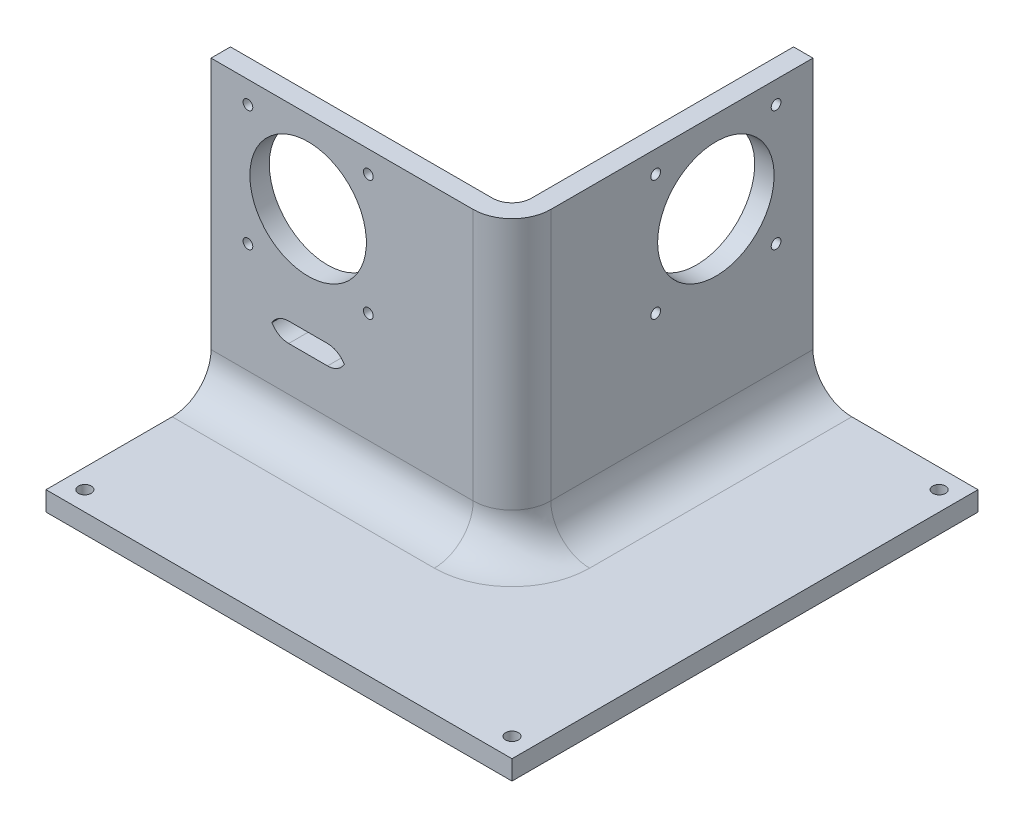
ISO-10303-21;
HEADER;
FILE_DESCRIPTION(('STEP AP214'),'2;1');
FILE_NAME('part.step','',(''),(''),'','','');
FILE_SCHEMA(('AUTOMOTIVE_DESIGN { 1 0 10303 214 1 1 1 1 }'));
ENDSEC;
DATA;
#1=APPLICATION_CONTEXT('core data for automotive mechanical design processes');
#2=APPLICATION_PROTOCOL_DEFINITION('international standard','automotive_design',2000,#1);
#3=PRODUCT_CONTEXT('',#1,'mechanical');
#4=PRODUCT('Part','Part','',(#3));
#5=PRODUCT_RELATED_PRODUCT_CATEGORY('part','',(#4));
#6=PRODUCT_DEFINITION_FORMATION('','',#4);
#7=PRODUCT_DEFINITION_CONTEXT('part definition',#1,'design');
#8=PRODUCT_DEFINITION('design','',#6,#7);
#9=PRODUCT_DEFINITION_SHAPE('','',#8);
#10=(LENGTH_UNIT() NAMED_UNIT(*) SI_UNIT(.MILLI.,.METRE.));
#11=(NAMED_UNIT(*) PLANE_ANGLE_UNIT() SI_UNIT($,.RADIAN.));
#12=(NAMED_UNIT(*) SI_UNIT($,.STERADIAN.) SOLID_ANGLE_UNIT());
#13=UNCERTAINTY_MEASURE_WITH_UNIT(LENGTH_MEASURE(1.E-05),#10,'distance_accuracy_value','');
#14=(GEOMETRIC_REPRESENTATION_CONTEXT(3) GLOBAL_UNCERTAINTY_ASSIGNED_CONTEXT((#13)) GLOBAL_UNIT_ASSIGNED_CONTEXT((#10,
#11,#12)) REPRESENTATION_CONTEXT('',''));
#15=CARTESIAN_POINT('',(0.,0.,0.));
#16=DIRECTION('',(0.,0.,1.));
#17=DIRECTION('',(1.,0.,0.));
#18=AXIS2_PLACEMENT_3D('',#15,#16,#17);
#19=CARTESIAN_POINT('',(0.,20.,-72.5));
#20=DIRECTION('',(0.,0.,-1.));
#21=DIRECTION('',(-1.,0.,0.));
#22=AXIS2_PLACEMENT_3D('',#19,#20,#21);
#23=PLANE('',#22);
#24=DIRECTION('',(0.,-1.,0.));
#25=VECTOR('',#24,1.);
#26=CARTESIAN_POINT('',(5.,80.,-72.5));
#27=LINE('',#26,#25);
#28=CARTESIAN_POINT('',(5.,80.,-72.5));
#29=VERTEX_POINT('',#28);
#30=CARTESIAN_POINT('',(5.,15.,-72.5));
#31=VERTEX_POINT('',#30);
#32=EDGE_CURVE('E294',#29,#31,#27,.T.);
#33=ORIENTED_EDGE('',*,*,#32,.T.);
#34=CARTESIAN_POINT('',(15.,15.,-72.5));
#35=DIRECTION('',(0.,0.,-1.));
#36=DIRECTION('',(-1.,0.,0.));
#37=AXIS2_PLACEMENT_3D('',#34,#35,#36);
#38=CIRCLE('',#37,10.);
#39=CARTESIAN_POINT('',(15.,5.,-72.5));
#40=VERTEX_POINT('',#39);
#41=EDGE_CURVE('E377',#31,#40,#38,.F.);
#42=ORIENTED_EDGE('',*,*,#41,.T.);
#43=DIRECTION('',(-1.,0.,0.));
#44=VECTOR('',#43,1.);
#45=CARTESIAN_POINT('',(47.5,5.,-72.5));
#46=LINE('',#45,#44);
#47=CARTESIAN_POINT('',(47.5,5.,-72.5));
#48=VERTEX_POINT('',#47);
#49=EDGE_CURVE('E215',#48,#40,#46,.T.);
#50=ORIENTED_EDGE('',*,*,#49,.F.);
#51=DIRECTION('',(0.,1.,0.));
#52=VECTOR('',#51,1.);
#53=CARTESIAN_POINT('',(47.5,-80.,-72.5));
#54=LINE('',#53,#52);
#55=CARTESIAN_POINT('',(47.5,0.,-72.5));
#56=VERTEX_POINT('',#55);
#57=EDGE_CURVE('E224',#56,#48,#54,.T.);
#58=ORIENTED_EDGE('',*,*,#57,.F.);
#59=DIRECTION('',(1.,0.,0.));
#60=VECTOR('',#59,1.);
#61=CARTESIAN_POINT('',(0.,0.,-72.5));
#62=LINE('',#61,#60);
#63=CARTESIAN_POINT('',(0.,0.,-72.5));
#64=VERTEX_POINT('',#63);
#65=EDGE_CURVE('E305',#64,#56,#62,.T.);
#66=ORIENTED_EDGE('',*,*,#65,.F.);
#67=DIRECTION('',(0.,-1.,0.));
#68=VECTOR('',#67,1.);
#69=CARTESIAN_POINT('',(0.,20.,-72.5));
#70=LINE('',#69,#68);
#71=CARTESIAN_POINT('',(0.,80.,-72.5));
#72=VERTEX_POINT('',#71);
#73=EDGE_CURVE('E308',#72,#64,#70,.T.);
#74=ORIENTED_EDGE('',*,*,#73,.F.);
#75=DIRECTION('',(-1.,0.,0.));
#76=VECTOR('',#75,1.);
#77=CARTESIAN_POINT('',(0.,80.,-72.5));
#78=LINE('',#77,#76);
#79=EDGE_CURVE('E288',#29,#72,#78,.T.);
#80=ORIENTED_EDGE('',*,*,#79,.F.);
#81=EDGE_LOOP('',(#33,#42,#50,#58,#66,#74,#80));
#82=FACE_BOUND('',#81,.T.);
#83=ADVANCED_FACE('F71',(#82),#23,.T.);
#84=CARTESIAN_POINT('',(0.,0.,0.));
#85=DIRECTION('',(0.,1.,0.));
#86=DIRECTION('',(0.,0.,1.));
#87=AXIS2_PLACEMENT_3D('',#84,#85,#86);
#88=PLANE('',#87);
#89=CARTESIAN_POINT('',(42.5,0.,-67.5));
#90=DIRECTION('',(0.,1.,0.));
#91=DIRECTION('',(0.,0.,1.));
#92=AXIS2_PLACEMENT_3D('',#89,#90,#91);
#93=CIRCLE('',#92,1.65);
#94=CARTESIAN_POINT('',(42.5,0.,-65.85));
#95=VERTEX_POINT('',#94);
#96=EDGE_CURVE('E231',#95,#95,#93,.T.);
#97=ORIENTED_EDGE('',*,*,#96,.T.);
#98=EDGE_LOOP('',(#97));
#99=FACE_BOUND('',#98,.T.);
#100=CARTESIAN_POINT('',(42.5,0.,42.5));
#101=DIRECTION('',(0.,1.,0.));
#102=DIRECTION('',(0.,0.,1.));
#103=AXIS2_PLACEMENT_3D('',#100,#101,#102);
#104=CIRCLE('',#103,1.65);
#105=CARTESIAN_POINT('',(42.5,0.,44.15));
#106=VERTEX_POINT('',#105);
#107=EDGE_CURVE('E235',#106,#106,#104,.T.);
#108=ORIENTED_EDGE('',*,*,#107,.T.);
#109=EDGE_LOOP('',(#108));
#110=FACE_BOUND('',#109,.T.);
#111=CARTESIAN_POINT('',(-67.5,0.,42.5));
#112=DIRECTION('',(0.,1.,0.));
#113=DIRECTION('',(0.,0.,1.));
#114=AXIS2_PLACEMENT_3D('',#111,#112,#113);
#115=CIRCLE('',#114,1.65);
#116=CARTESIAN_POINT('',(-67.5,0.,44.15));
#117=VERTEX_POINT('',#116);
#118=EDGE_CURVE('E350',#117,#117,#115,.T.);
#119=ORIENTED_EDGE('',*,*,#118,.T.);
#120=EDGE_LOOP('',(#119));
#121=FACE_BOUND('',#120,.T.);
#122=DIRECTION('',(0.,0.,-1.));
#123=VECTOR('',#122,1.);
#124=CARTESIAN_POINT('',(47.5,0.,0.));
#125=LINE('',#124,#123);
#126=CARTESIAN_POINT('',(47.5,0.,47.5));
#127=VERTEX_POINT('',#126);
#128=EDGE_CURVE('E347',#127,#56,#125,.T.);
#129=ORIENTED_EDGE('',*,*,#128,.F.);
#130=DIRECTION('',(-1.,0.,0.));
#131=VECTOR('',#130,1.);
#132=CARTESIAN_POINT('',(0.,0.,47.5));
#133=LINE('',#132,#131);
#134=CARTESIAN_POINT('',(-72.5,0.,47.5));
#135=VERTEX_POINT('',#134);
#136=EDGE_CURVE('E229',#127,#135,#133,.T.);
#137=ORIENTED_EDGE('',*,*,#136,.T.);
#138=DIRECTION('',(0.,0.,-1.));
#139=VECTOR('',#138,1.);
#140=CARTESIAN_POINT('',(-72.5,0.,0.));
#141=LINE('',#140,#139);
#142=CARTESIAN_POINT('',(-72.5,0.,0.));
#143=VERTEX_POINT('',#142);
#144=EDGE_CURVE('E303',#135,#143,#141,.T.);
#145=ORIENTED_EDGE('',*,*,#144,.T.);
#146=DIRECTION('',(-1.,0.,0.));
#147=VECTOR('',#146,1.);
#148=CARTESIAN_POINT('',(0.,0.,0.));
#149=LINE('',#148,#147);
#150=CARTESIAN_POINT('',(-5.,0.,0.));
#151=VERTEX_POINT('',#150);
#152=EDGE_CURVE('E300',#151,#143,#149,.T.);
#153=ORIENTED_EDGE('',*,*,#152,.F.);
#154=CARTESIAN_POINT('',(-5.,0.,-5.));
#155=DIRECTION('',(0.,1.,0.));
#156=DIRECTION('',(0.,0.,1.));
#157=AXIS2_PLACEMENT_3D('',#154,#155,#156);
#158=CIRCLE('',#157,5.);
#159=CARTESIAN_POINT('',(0.,0.,-5.));
#160=VERTEX_POINT('',#159);
#161=EDGE_CURVE('E342',#151,#160,#158,.T.);
#162=ORIENTED_EDGE('',*,*,#161,.T.);
#163=DIRECTION('',(0.,0.,1.));
#164=VECTOR('',#163,1.);
#165=CARTESIAN_POINT('',(0.,0.,0.));
#166=LINE('',#165,#164);
#167=EDGE_CURVE('E297',#64,#160,#166,.T.);
#168=ORIENTED_EDGE('',*,*,#167,.F.);
#169=ORIENTED_EDGE('',*,*,#65,.T.);
#170=EDGE_LOOP('',(#129,#137,#145,#153,#162,#168,#169));
#171=FACE_BOUND('',#170,.T.);
#172=ADVANCED_FACE('F468',(#99,#110,#121,#171),#88,.F.);
#173=CARTESIAN_POINT('',(0.,20.,0.));
#174=DIRECTION('',(1.,0.,0.));
#175=DIRECTION('',(0.,0.,-1.));
#176=AXIS2_PLACEMENT_3D('',#173,#174,#175);
#177=PLANE('',#176);
#178=CARTESIAN_POINT('',(0.,43.35,-32.));
#179=DIRECTION('',(-1.,0.,0.));
#180=DIRECTION('',(0.,0.,1.));
#181=AXIS2_PLACEMENT_3D('',#178,#179,#180);
#182=CIRCLE('',#181,1.25);
#183=CARTESIAN_POINT('',(0.,43.35,-30.75));
#184=VERTEX_POINT('',#183);
#185=EDGE_CURVE('E268',#184,#184,#182,.T.);
#186=ORIENTED_EDGE('',*,*,#185,.F.);
#187=EDGE_LOOP('',(#186));
#188=FACE_BOUND('',#187,.T.);
#189=CARTESIAN_POINT('',(0.,43.35,-63.));
#190=DIRECTION('',(-1.,0.,0.));
#191=DIRECTION('',(0.,0.,1.));
#192=AXIS2_PLACEMENT_3D('',#189,#190,#191);
#193=CIRCLE('',#192,1.25);
#194=CARTESIAN_POINT('',(0.,43.35,-61.75));
#195=VERTEX_POINT('',#194);
#196=EDGE_CURVE('E273',#195,#195,#193,.T.);
#197=ORIENTED_EDGE('',*,*,#196,.F.);
#198=EDGE_LOOP('',(#197));
#199=FACE_BOUND('',#198,.T.);
#200=CARTESIAN_POINT('',(0.,74.35,-63.));
#201=DIRECTION('',(-1.,0.,0.));
#202=DIRECTION('',(0.,0.,1.));
#203=AXIS2_PLACEMENT_3D('',#200,#201,#202);
#204=CIRCLE('',#203,1.25);
#205=CARTESIAN_POINT('',(0.,74.35,-61.75));
#206=VERTEX_POINT('',#205);
#207=EDGE_CURVE('E269',#206,#206,#204,.T.);
#208=ORIENTED_EDGE('',*,*,#207,.F.);
#209=EDGE_LOOP('',(#208));
#210=FACE_BOUND('',#209,.T.);
#211=CARTESIAN_POINT('',(0.,74.35,-32.));
#212=DIRECTION('',(-1.,0.,0.));
#213=DIRECTION('',(0.,0.,1.));
#214=AXIS2_PLACEMENT_3D('',#211,#212,#213);
#215=CIRCLE('',#214,1.25);
#216=CARTESIAN_POINT('',(0.,74.35,-30.75));
#217=VERTEX_POINT('',#216);
#218=EDGE_CURVE('E272',#217,#217,#215,.T.);
#219=ORIENTED_EDGE('',*,*,#218,.F.);
#220=EDGE_LOOP('',(#219));
#221=FACE_BOUND('',#220,.T.);
#222=CARTESIAN_POINT('',(0.,58.85,-47.5));
#223=DIRECTION('',(-1.,0.,0.));
#224=DIRECTION('',(0.,0.,1.));
#225=AXIS2_PLACEMENT_3D('',#222,#223,#224);
#226=CIRCLE('',#225,15.);
#227=CARTESIAN_POINT('',(0.,58.85,-32.5));
#228=VERTEX_POINT('',#227);
#229=EDGE_CURVE('E281',#228,#228,#226,.T.);
#230=ORIENTED_EDGE('',*,*,#229,.F.);
#231=EDGE_LOOP('',(#230));
#232=FACE_BOUND('',#231,.T.);
#233=ORIENTED_EDGE('',*,*,#167,.T.);
#234=DIRECTION('',(0.,-1.,0.));
#235=VECTOR('',#234,1.);
#236=CARTESIAN_POINT('',(0.,80.,-5.));
#237=LINE('',#236,#235);
#238=CARTESIAN_POINT('',(0.,80.,-5.));
#239=VERTEX_POINT('',#238);
#240=EDGE_CURVE('E340',#160,#239,#237,.F.);
#241=ORIENTED_EDGE('',*,*,#240,.T.);
#242=DIRECTION('',(0.,0.,1.));
#243=VECTOR('',#242,1.);
#244=CARTESIAN_POINT('',(0.,80.,0.));
#245=LINE('',#244,#243);
#246=EDGE_CURVE('E291',#72,#239,#245,.T.);
#247=ORIENTED_EDGE('',*,*,#246,.F.);
#248=ORIENTED_EDGE('',*,*,#73,.T.);
#249=EDGE_LOOP('',(#233,#241,#247,#248));
#250=FACE_BOUND('',#249,.T.);
#251=ADVANCED_FACE('F474',(#188,#199,#210,#221,#232,#250),#177,.F.);
#252=CARTESIAN_POINT('',(0.,20.,0.));
#253=DIRECTION('',(0.,0.,1.));
#254=DIRECTION('',(1.,0.,0.));
#255=AXIS2_PLACEMENT_3D('',#252,#253,#254);
#256=PLANE('',#255);
#257=DIRECTION('',(-1.,0.,0.));
#258=VECTOR('',#257,1.);
#259=CARTESIAN_POINT('',(0.,31.35,0.));
#260=LINE('',#259,#258);
#261=CARTESIAN_POINT('',(-42.5,31.35,0.));
#262=VERTEX_POINT('',#261);
#263=CARTESIAN_POINT('',(-52.5,31.35,0.));
#264=VERTEX_POINT('',#263);
#265=EDGE_CURVE('E434',#262,#264,#260,.T.);
#266=ORIENTED_EDGE('',*,*,#265,.T.);
#267=CARTESIAN_POINT('',(-52.5,26.35,0.));
#268=DIRECTION('',(0.,0.,1.));
#269=DIRECTION('',(1.,0.,0.));
#270=AXIS2_PLACEMENT_3D('',#267,#268,#269);
#271=CIRCLE('',#270,5.);
#272=CARTESIAN_POINT('',(-56.8301270189222,28.85,0.));
#273=VERTEX_POINT('',#272);
#274=EDGE_CURVE('E405',#264,#273,#271,.T.);
#275=ORIENTED_EDGE('',*,*,#274,.T.);
#276=CARTESIAN_POINT('',(-52.5,31.35,0.));
#277=DIRECTION('',(0.,0.,1.));
#278=DIRECTION('',(1.,0.,0.));
#279=AXIS2_PLACEMENT_3D('',#276,#277,#278);
#280=CIRCLE('',#279,5.);
#281=CARTESIAN_POINT('',(-52.5,26.35,0.));
#282=VERTEX_POINT('',#281);
#283=EDGE_CURVE('E401',#273,#282,#280,.T.);
#284=ORIENTED_EDGE('',*,*,#283,.T.);
#285=DIRECTION('',(1.,0.,0.));
#286=VECTOR('',#285,1.);
#287=CARTESIAN_POINT('',(0.,26.35,0.));
#288=LINE('',#287,#286);
#289=CARTESIAN_POINT('',(-42.5,26.35,0.));
#290=VERTEX_POINT('',#289);
#291=EDGE_CURVE('E384',#282,#290,#288,.T.);
#292=ORIENTED_EDGE('',*,*,#291,.T.);
#293=CARTESIAN_POINT('',(-42.5,31.35,0.));
#294=DIRECTION('',(0.,0.,1.));
#295=DIRECTION('',(1.,0.,0.));
#296=AXIS2_PLACEMENT_3D('',#293,#294,#295);
#297=CIRCLE('',#296,5.);
#298=CARTESIAN_POINT('',(-38.1698729810778,28.85,0.));
#299=VERTEX_POINT('',#298);
#300=EDGE_CURVE('E14',#290,#299,#297,.T.);
#301=ORIENTED_EDGE('',*,*,#300,.T.);
#302=CARTESIAN_POINT('',(-42.5,26.35,0.));
#303=DIRECTION('',(0.,0.,1.));
#304=DIRECTION('',(1.,0.,0.));
#305=AXIS2_PLACEMENT_3D('',#302,#303,#304);
#306=CIRCLE('',#305,5.);
#307=EDGE_CURVE('E408',#299,#262,#306,.T.);
#308=ORIENTED_EDGE('',*,*,#307,.T.);
#309=EDGE_LOOP('',(#266,#275,#284,#292,#301,#308));
#310=FACE_BOUND('',#309,.T.);
#311=CARTESIAN_POINT('',(-32.,43.35,0.));
#312=DIRECTION('',(0.,0.,1.));
#313=DIRECTION('',(1.,0.,0.));
#314=AXIS2_PLACEMENT_3D('',#311,#312,#313);
#315=CIRCLE('',#314,1.25);
#316=CARTESIAN_POINT('',(-30.75,43.35,0.));
#317=VERTEX_POINT('',#316);
#318=EDGE_CURVE('E246',#317,#317,#315,.T.);
#319=ORIENTED_EDGE('',*,*,#318,.T.);
#320=EDGE_LOOP('',(#319));
#321=FACE_BOUND('',#320,.T.);
#322=CARTESIAN_POINT('',(-63.,43.35,0.));
#323=DIRECTION('',(0.,0.,1.));
#324=DIRECTION('',(1.,0.,0.));
#325=AXIS2_PLACEMENT_3D('',#322,#323,#324);
#326=CIRCLE('',#325,1.25);
#327=CARTESIAN_POINT('',(-61.75,43.35,0.));
#328=VERTEX_POINT('',#327);
#329=EDGE_CURVE('E243',#328,#328,#326,.T.);
#330=ORIENTED_EDGE('',*,*,#329,.T.);
#331=EDGE_LOOP('',(#330));
#332=FACE_BOUND('',#331,.T.);
#333=CARTESIAN_POINT('',(-63.,74.35,0.));
#334=DIRECTION('',(0.,0.,1.));
#335=DIRECTION('',(1.,0.,0.));
#336=AXIS2_PLACEMENT_3D('',#333,#334,#335);
#337=CIRCLE('',#336,1.25);
#338=CARTESIAN_POINT('',(-61.75,74.35,0.));
#339=VERTEX_POINT('',#338);
#340=EDGE_CURVE('E239',#339,#339,#337,.T.);
#341=ORIENTED_EDGE('',*,*,#340,.T.);
#342=EDGE_LOOP('',(#341));
#343=FACE_BOUND('',#342,.T.);
#344=CARTESIAN_POINT('',(-32.,74.35,0.));
#345=DIRECTION('',(0.,0.,1.));
#346=DIRECTION('',(1.,0.,0.));
#347=AXIS2_PLACEMENT_3D('',#344,#345,#346);
#348=CIRCLE('',#347,1.25);
#349=CARTESIAN_POINT('',(-30.75,74.35,0.));
#350=VERTEX_POINT('',#349);
#351=EDGE_CURVE('E242',#350,#350,#348,.T.);
#352=ORIENTED_EDGE('',*,*,#351,.T.);
#353=EDGE_LOOP('',(#352));
#354=FACE_BOUND('',#353,.T.);
#355=CARTESIAN_POINT('',(-47.5,58.85,0.));
#356=DIRECTION('',(0.,0.,1.));
#357=DIRECTION('',(1.,0.,0.));
#358=AXIS2_PLACEMENT_3D('',#355,#356,#357);
#359=CIRCLE('',#358,15.);
#360=CARTESIAN_POINT('',(-32.5,58.85,0.));
#361=VERTEX_POINT('',#360);
#362=EDGE_CURVE('E252',#361,#361,#359,.T.);
#363=ORIENTED_EDGE('',*,*,#362,.T.);
#364=EDGE_LOOP('',(#363));
#365=FACE_BOUND('',#364,.T.);
#366=DIRECTION('',(-1.,0.,0.));
#367=VECTOR('',#366,1.);
#368=CARTESIAN_POINT('',(-72.5,80.,0.));
#369=LINE('',#368,#367);
#370=CARTESIAN_POINT('',(-5.,80.,0.));
#371=VERTEX_POINT('',#370);
#372=CARTESIAN_POINT('',(-72.5,80.,0.));
#373=VERTEX_POINT('',#372);
#374=EDGE_CURVE('E263',#371,#373,#369,.T.);
#375=ORIENTED_EDGE('',*,*,#374,.F.);
#376=DIRECTION('',(0.,-1.,0.));
#377=VECTOR('',#376,1.);
#378=CARTESIAN_POINT('',(-5.,0.,0.));
#379=LINE('',#378,#377);
#380=EDGE_CURVE('E313',#371,#151,#379,.T.);
#381=ORIENTED_EDGE('',*,*,#380,.T.);
#382=ORIENTED_EDGE('',*,*,#152,.T.);
#383=DIRECTION('',(0.,-1.,0.));
#384=VECTOR('',#383,1.);
#385=CARTESIAN_POINT('',(-72.5,20.,0.));
#386=LINE('',#385,#384);
#387=EDGE_CURVE('E310',#373,#143,#386,.T.);
#388=ORIENTED_EDGE('',*,*,#387,.F.);
#389=EDGE_LOOP('',(#375,#381,#382,#388));
#390=FACE_BOUND('',#389,.T.);
#391=ADVANCED_FACE('F483',(#310,#321,#332,#343,#354,#365,#390),#256,.F.);
#392=CARTESIAN_POINT('',(-72.5,20.,0.));
#393=DIRECTION('',(-1.,0.,0.));
#394=DIRECTION('',(0.,0.,1.));
#395=AXIS2_PLACEMENT_3D('',#392,#393,#394);
#396=PLANE('',#395);
#397=DIRECTION('',(0.,0.,1.));
#398=VECTOR('',#397,1.);
#399=CARTESIAN_POINT('',(-72.5,5.,5.00000000000002));
#400=LINE('',#399,#398);
#401=CARTESIAN_POINT('',(-72.5,5.,15.));
#402=VERTEX_POINT('',#401);
#403=CARTESIAN_POINT('',(-72.5,5.,47.5));
#404=VERTEX_POINT('',#403);
#405=EDGE_CURVE('E211',#402,#404,#400,.T.);
#406=ORIENTED_EDGE('',*,*,#405,.F.);
#407=CARTESIAN_POINT('',(-72.5,15.,15.));
#408=DIRECTION('',(-1.,0.,0.));
#409=DIRECTION('',(0.,0.,1.));
#410=AXIS2_PLACEMENT_3D('',#407,#408,#409);
#411=CIRCLE('',#410,10.);
#412=CARTESIAN_POINT('',(-72.5,15.,5.00000000000001));
#413=VERTEX_POINT('',#412);
#414=EDGE_CURVE('E375',#402,#413,#411,.F.);
#415=ORIENTED_EDGE('',*,*,#414,.T.);
#416=DIRECTION('',(0.,-1.,0.));
#417=VECTOR('',#416,1.);
#418=CARTESIAN_POINT('',(-72.5,80.,5.00000000000001));
#419=LINE('',#418,#417);
#420=CARTESIAN_POINT('',(-72.5,80.,5.00000000000001));
#421=VERTEX_POINT('',#420);
#422=EDGE_CURVE('E265',#421,#413,#419,.T.);
#423=ORIENTED_EDGE('',*,*,#422,.F.);
#424=DIRECTION('',(0.,0.,1.));
#425=VECTOR('',#424,1.);
#426=CARTESIAN_POINT('',(-72.5,80.,0.));
#427=LINE('',#426,#425);
#428=EDGE_CURVE('E257',#373,#421,#427,.T.);
#429=ORIENTED_EDGE('',*,*,#428,.F.);
#430=ORIENTED_EDGE('',*,*,#387,.T.);
#431=ORIENTED_EDGE('',*,*,#144,.F.);
#432=DIRECTION('',(0.,1.,0.));
#433=VECTOR('',#432,1.);
#434=CARTESIAN_POINT('',(-72.5,-80.,47.5));
#435=LINE('',#434,#433);
#436=EDGE_CURVE('E230',#135,#404,#435,.T.);
#437=ORIENTED_EDGE('',*,*,#436,.T.);
#438=EDGE_LOOP('',(#406,#415,#423,#429,#430,#431,#437));
#439=FACE_BOUND('',#438,.T.);
#440=ADVANCED_FACE('F479',(#439),#396,.T.);
#441=CARTESIAN_POINT('',(5.,80.,0.));
#442=DIRECTION('',(-1.,0.,0.));
#443=DIRECTION('',(0.,0.,1.));
#444=AXIS2_PLACEMENT_3D('',#441,#442,#443);
#445=PLANE('',#444);
#446=CARTESIAN_POINT('',(5.,43.35,-32.));
#447=DIRECTION('',(-1.,0.,0.));
#448=DIRECTION('',(0.,0.,1.));
#449=AXIS2_PLACEMENT_3D('',#446,#447,#448);
#450=CIRCLE('',#449,1.25);
#451=CARTESIAN_POINT('',(5.,43.35,-30.75));
#452=VERTEX_POINT('',#451);
#453=EDGE_CURVE('E285',#452,#452,#450,.T.);
#454=ORIENTED_EDGE('',*,*,#453,.T.);
#455=EDGE_LOOP('',(#454));
#456=FACE_BOUND('',#455,.T.);
#457=CARTESIAN_POINT('',(5.,43.35,-63.));
#458=DIRECTION('',(-1.,0.,0.));
#459=DIRECTION('',(0.,0.,1.));
#460=AXIS2_PLACEMENT_3D('',#457,#458,#459);
#461=CIRCLE('',#460,1.25);
#462=CARTESIAN_POINT('',(5.,43.35,-61.75));
#463=VERTEX_POINT('',#462);
#464=EDGE_CURVE('E321',#463,#463,#461,.T.);
#465=ORIENTED_EDGE('',*,*,#464,.T.);
#466=EDGE_LOOP('',(#465));
#467=FACE_BOUND('',#466,.T.);
#468=CARTESIAN_POINT('',(5.,74.35,-63.));
#469=DIRECTION('',(-1.,0.,0.));
#470=DIRECTION('',(0.,0.,1.));
#471=AXIS2_PLACEMENT_3D('',#468,#469,#470);
#472=CIRCLE('',#471,1.25);
#473=CARTESIAN_POINT('',(5.,74.35,-61.75));
#474=VERTEX_POINT('',#473);
#475=EDGE_CURVE('E318',#474,#474,#472,.T.);
#476=ORIENTED_EDGE('',*,*,#475,.T.);
#477=EDGE_LOOP('',(#476));
#478=FACE_BOUND('',#477,.T.);
#479=CARTESIAN_POINT('',(5.,74.35,-32.));
#480=DIRECTION('',(-1.,0.,0.));
#481=DIRECTION('',(0.,0.,1.));
#482=AXIS2_PLACEMENT_3D('',#479,#480,#481);
#483=CIRCLE('',#482,1.25);
#484=CARTESIAN_POINT('',(5.,74.35,-30.75));
#485=VERTEX_POINT('',#484);
#486=EDGE_CURVE('E280',#485,#485,#483,.T.);
#487=ORIENTED_EDGE('',*,*,#486,.T.);
#488=EDGE_LOOP('',(#487));
#489=FACE_BOUND('',#488,.T.);
#490=CARTESIAN_POINT('',(5.,58.85,-47.5));
#491=DIRECTION('',(-1.,0.,0.));
#492=DIRECTION('',(0.,0.,1.));
#493=AXIS2_PLACEMENT_3D('',#490,#491,#492);
#494=CIRCLE('',#493,15.);
#495=CARTESIAN_POINT('',(5.,58.85,-32.5));
#496=VERTEX_POINT('',#495);
#497=EDGE_CURVE('E284',#496,#496,#494,.T.);
#498=ORIENTED_EDGE('',*,*,#497,.T.);
#499=EDGE_LOOP('',(#498));
#500=FACE_BOUND('',#499,.T.);
#501=DIRECTION('',(0.,-1.,0.));
#502=VECTOR('',#501,1.);
#503=CARTESIAN_POINT('',(5.,80.,-4.99999999999999));
#504=LINE('',#503,#502);
#505=CARTESIAN_POINT('',(5.,80.,-4.99999999999999));
#506=VERTEX_POINT('',#505);
#507=CARTESIAN_POINT('',(5.,15.,-4.99999999999999));
#508=VERTEX_POINT('',#507);
#509=EDGE_CURVE('E369',#506,#508,#504,.T.);
#510=ORIENTED_EDGE('',*,*,#509,.T.);
#511=DIRECTION('',(0.,0.,-1.));
#512=VECTOR('',#511,1.);
#513=CARTESIAN_POINT('',(5.,15.,-72.5));
#514=LINE('',#513,#512);
#515=EDGE_CURVE('E371',#508,#31,#514,.T.);
#516=ORIENTED_EDGE('',*,*,#515,.T.);
#517=ORIENTED_EDGE('',*,*,#32,.F.);
#518=DIRECTION('',(0.,0.,-1.));
#519=VECTOR('',#518,1.);
#520=CARTESIAN_POINT('',(5.,80.,0.));
#521=LINE('',#520,#519);
#522=EDGE_CURVE('E286',#506,#29,#521,.T.);
#523=ORIENTED_EDGE('',*,*,#522,.F.);
#524=EDGE_LOOP('',(#510,#516,#517,#523));
#525=FACE_BOUND('',#524,.T.);
#526=ADVANCED_FACE('F482',(#456,#467,#478,#489,#500,#525),#445,.F.);
#527=CARTESIAN_POINT('',(0.,80.,0.));
#528=DIRECTION('',(0.,-1.,0.));
#529=DIRECTION('',(0.,0.,-1.));
#530=AXIS2_PLACEMENT_3D('',#527,#528,#529);
#531=PLANE('',#530);
#532=DIRECTION('',(1.,0.,0.));
#533=VECTOR('',#532,1.);
#534=CARTESIAN_POINT('',(-72.5,80.,5.00000000000001));
#535=LINE('',#534,#533);
#536=CARTESIAN_POINT('',(-5.,80.,5.00000000000001));
#537=VERTEX_POINT('',#536);
#538=EDGE_CURVE('E260',#421,#537,#535,.T.);
#539=ORIENTED_EDGE('',*,*,#538,.T.);
#540=CARTESIAN_POINT('',(-5.,80.,-4.99999999999999));
#541=DIRECTION('',(0.,-1.,0.));
#542=DIRECTION('',(0.,0.,-1.));
#543=AXIS2_PLACEMENT_3D('',#540,#541,#542);
#544=CIRCLE('',#543,10.);
#545=EDGE_CURVE('E373',#537,#506,#544,.F.);
#546=ORIENTED_EDGE('',*,*,#545,.T.);
#547=ORIENTED_EDGE('',*,*,#522,.T.);
#548=ORIENTED_EDGE('',*,*,#79,.T.);
#549=ORIENTED_EDGE('',*,*,#246,.T.);
#550=CARTESIAN_POINT('',(-5.,80.,-5.));
#551=DIRECTION('',(0.,-1.,0.));
#552=DIRECTION('',(0.,0.,-1.));
#553=AXIS2_PLACEMENT_3D('',#550,#551,#552);
#554=CIRCLE('',#553,5.);
#555=EDGE_CURVE('E344',#239,#371,#554,.T.);
#556=ORIENTED_EDGE('',*,*,#555,.T.);
#557=ORIENTED_EDGE('',*,*,#374,.T.);
#558=ORIENTED_EDGE('',*,*,#428,.T.);
#559=EDGE_LOOP('',(#539,#546,#547,#548,#549,#556,#557,#558));
#560=FACE_BOUND('',#559,.T.);
#561=ADVANCED_FACE('F567',(#560),#531,.F.);
#562=CARTESIAN_POINT('',(100.,58.85,-47.5));
#563=DIRECTION('',(-1.,0.,0.));
#564=DIRECTION('',(0.,0.,1.));
#565=AXIS2_PLACEMENT_3D('',#562,#563,#564);
#566=CYLINDRICAL_SURFACE('',#565,15.);
#567=ORIENTED_EDGE('',*,*,#229,.T.);
#568=EDGE_LOOP('',(#567));
#569=FACE_BOUND('',#568,.T.);
#570=ORIENTED_EDGE('',*,*,#497,.F.);
#571=EDGE_LOOP('',(#570));
#572=FACE_BOUND('',#571,.T.);
#573=ADVANCED_FACE('F572',(#569,#572),#566,.F.);
#574=CARTESIAN_POINT('',(100.,74.35,-32.));
#575=DIRECTION('',(-1.,0.,0.));
#576=DIRECTION('',(0.,0.,1.));
#577=AXIS2_PLACEMENT_3D('',#574,#575,#576);
#578=CYLINDRICAL_SURFACE('',#577,1.25);
#579=ORIENTED_EDGE('',*,*,#218,.T.);
#580=EDGE_LOOP('',(#579));
#581=FACE_BOUND('',#580,.T.);
#582=ORIENTED_EDGE('',*,*,#486,.F.);
#583=EDGE_LOOP('',(#582));
#584=FACE_BOUND('',#583,.T.);
#585=ADVANCED_FACE('F737',(#581,#584),#578,.F.);
#586=CARTESIAN_POINT('',(100.,74.35,-62.9999999999999));
#587=DIRECTION('',(-1.,0.,0.));
#588=DIRECTION('',(0.,0.,1.));
#589=AXIS2_PLACEMENT_3D('',#586,#587,#588);
#590=CYLINDRICAL_SURFACE('',#589,1.25);
#591=ORIENTED_EDGE('',*,*,#207,.T.);
#592=EDGE_LOOP('',(#591));
#593=FACE_BOUND('',#592,.T.);
#594=ORIENTED_EDGE('',*,*,#475,.F.);
#595=EDGE_LOOP('',(#594));
#596=FACE_BOUND('',#595,.T.);
#597=ADVANCED_FACE('F727',(#593,#596),#590,.F.);
#598=CARTESIAN_POINT('',(100.,43.35,-63.));
#599=DIRECTION('',(-1.,0.,0.));
#600=DIRECTION('',(0.,0.,1.));
#601=AXIS2_PLACEMENT_3D('',#598,#599,#600);
#602=CYLINDRICAL_SURFACE('',#601,1.25);
#603=ORIENTED_EDGE('',*,*,#196,.T.);
#604=EDGE_LOOP('',(#603));
#605=FACE_BOUND('',#604,.T.);
#606=ORIENTED_EDGE('',*,*,#464,.F.);
#607=EDGE_LOOP('',(#606));
#608=FACE_BOUND('',#607,.T.);
#609=ADVANCED_FACE('F717',(#605,#608),#602,.F.);
#610=CARTESIAN_POINT('',(100.,43.35,-32.));
#611=DIRECTION('',(-1.,0.,0.));
#612=DIRECTION('',(0.,0.,1.));
#613=AXIS2_PLACEMENT_3D('',#610,#611,#612);
#614=CYLINDRICAL_SURFACE('',#613,1.25);
#615=ORIENTED_EDGE('',*,*,#185,.T.);
#616=EDGE_LOOP('',(#615));
#617=FACE_BOUND('',#616,.T.);
#618=ORIENTED_EDGE('',*,*,#453,.F.);
#619=EDGE_LOOP('',(#618));
#620=FACE_BOUND('',#619,.T.);
#621=ADVANCED_FACE('F712',(#617,#620),#614,.F.);
#622=CARTESIAN_POINT('',(-72.5,80.,5.00000000000001));
#623=DIRECTION('',(0.,0.,-1.));
#624=DIRECTION('',(-1.,0.,0.));
#625=AXIS2_PLACEMENT_3D('',#622,#623,#624);
#626=PLANE('',#625);
#627=CARTESIAN_POINT('',(-42.5,26.35,5.00000000000001));
#628=DIRECTION('',(0.,0.,-1.));
#629=DIRECTION('',(-1.,0.,0.));
#630=AXIS2_PLACEMENT_3D('',#627,#628,#629);
#631=CIRCLE('',#630,5.);
#632=CARTESIAN_POINT('',(-42.5,31.35,5.00000000000001));
#633=VERTEX_POINT('',#632);
#634=CARTESIAN_POINT('',(-38.1698729810778,28.85,5.00000000000001));
#635=VERTEX_POINT('',#634);
#636=EDGE_CURVE('E94',#633,#635,#631,.T.);
#637=ORIENTED_EDGE('',*,*,#636,.T.);
#638=CARTESIAN_POINT('',(-42.5,31.35,5.00000000000001));
#639=DIRECTION('',(0.,0.,-1.));
#640=DIRECTION('',(-1.,0.,0.));
#641=AXIS2_PLACEMENT_3D('',#638,#639,#640);
#642=CIRCLE('',#641,5.);
#643=CARTESIAN_POINT('',(-42.5,26.35,5.00000000000001));
#644=VERTEX_POINT('',#643);
#645=EDGE_CURVE('E80',#635,#644,#642,.T.);
#646=ORIENTED_EDGE('',*,*,#645,.T.);
#647=DIRECTION('',(1.,0.,0.));
#648=VECTOR('',#647,1.);
#649=CARTESIAN_POINT('',(-57.5,26.35,5.00000000000001));
#650=LINE('',#649,#648);
#651=CARTESIAN_POINT('',(-52.5,26.35,5.00000000000001));
#652=VERTEX_POINT('',#651);
#653=EDGE_CURVE('E417',#652,#644,#650,.T.);
#654=ORIENTED_EDGE('',*,*,#653,.F.);
#655=CARTESIAN_POINT('',(-52.5,31.35,5.00000000000001));
#656=DIRECTION('',(0.,0.,-1.));
#657=DIRECTION('',(-1.,0.,0.));
#658=AXIS2_PLACEMENT_3D('',#655,#656,#657);
#659=CIRCLE('',#658,5.);
#660=CARTESIAN_POINT('',(-56.8301270189222,28.85,5.00000000000001));
#661=VERTEX_POINT('',#660);
#662=EDGE_CURVE('E399',#652,#661,#659,.T.);
#663=ORIENTED_EDGE('',*,*,#662,.T.);
#664=CARTESIAN_POINT('',(-52.5,26.35,5.00000000000001));
#665=DIRECTION('',(0.,0.,-1.));
#666=DIRECTION('',(-1.,0.,0.));
#667=AXIS2_PLACEMENT_3D('',#664,#665,#666);
#668=CIRCLE('',#667,5.);
#669=CARTESIAN_POINT('',(-52.5,31.35,5.00000000000001));
#670=VERTEX_POINT('',#669);
#671=EDGE_CURVE('E403',#661,#670,#668,.T.);
#672=ORIENTED_EDGE('',*,*,#671,.T.);
#673=DIRECTION('',(-1.,0.,0.));
#674=VECTOR('',#673,1.);
#675=CARTESIAN_POINT('',(-57.5,31.35,5.00000000000001));
#676=LINE('',#675,#674);
#677=EDGE_CURVE('E412',#633,#670,#676,.T.);
#678=ORIENTED_EDGE('',*,*,#677,.F.);
#679=EDGE_LOOP('',(#637,#646,#654,#663,#672,#678));
#680=FACE_BOUND('',#679,.T.);
#681=CARTESIAN_POINT('',(-32.,43.35,5.));
#682=DIRECTION('',(0.,0.,-1.));
#683=DIRECTION('',(-1.,0.,0.));
#684=AXIS2_PLACEMENT_3D('',#681,#682,#683);
#685=CIRCLE('',#684,1.25);
#686=CARTESIAN_POINT('',(-33.25,43.35,5.));
#687=VERTEX_POINT('',#686);
#688=EDGE_CURVE('E256',#687,#687,#685,.F.);
#689=ORIENTED_EDGE('',*,*,#688,.F.);
#690=EDGE_LOOP('',(#689));
#691=FACE_BOUND('',#690,.T.);
#692=CARTESIAN_POINT('',(-63.,43.35,5.));
#693=DIRECTION('',(0.,0.,-1.));
#694=DIRECTION('',(-1.,0.,0.));
#695=AXIS2_PLACEMENT_3D('',#692,#693,#694);
#696=CIRCLE('',#695,1.25);
#697=CARTESIAN_POINT('',(-64.25,43.35,5.));
#698=VERTEX_POINT('',#697);
#699=EDGE_CURVE('E333',#698,#698,#696,.F.);
#700=ORIENTED_EDGE('',*,*,#699,.F.);
#701=EDGE_LOOP('',(#700));
#702=FACE_BOUND('',#701,.T.);
#703=CARTESIAN_POINT('',(-62.9999999999999,74.35,5.));
#704=DIRECTION('',(0.,0.,-1.));
#705=DIRECTION('',(-1.,0.,0.));
#706=AXIS2_PLACEMENT_3D('',#703,#704,#705);
#707=CIRCLE('',#706,1.25);
#708=CARTESIAN_POINT('',(-64.2499999999999,74.35,5.));
#709=VERTEX_POINT('',#708);
#710=EDGE_CURVE('E330',#709,#709,#707,.F.);
#711=ORIENTED_EDGE('',*,*,#710,.F.);
#712=EDGE_LOOP('',(#711));
#713=FACE_BOUND('',#712,.T.);
#714=CARTESIAN_POINT('',(-32.,74.35,5.));
#715=DIRECTION('',(0.,0.,-1.));
#716=DIRECTION('',(-1.,0.,0.));
#717=AXIS2_PLACEMENT_3D('',#714,#715,#716);
#718=CIRCLE('',#717,1.25);
#719=CARTESIAN_POINT('',(-33.25,74.35,5.));
#720=VERTEX_POINT('',#719);
#721=EDGE_CURVE('E251',#720,#720,#718,.F.);
#722=ORIENTED_EDGE('',*,*,#721,.F.);
#723=EDGE_LOOP('',(#722));
#724=FACE_BOUND('',#723,.T.);
#725=CARTESIAN_POINT('',(-47.5,58.85,5.));
#726=DIRECTION('',(0.,0.,-1.));
#727=DIRECTION('',(-1.,0.,0.));
#728=AXIS2_PLACEMENT_3D('',#725,#726,#727);
#729=CIRCLE('',#728,15.);
#730=CARTESIAN_POINT('',(-62.5,58.85,5.));
#731=VERTEX_POINT('',#730);
#732=EDGE_CURVE('E255',#731,#731,#729,.F.);
#733=ORIENTED_EDGE('',*,*,#732,.F.);
#734=EDGE_LOOP('',(#733));
#735=FACE_BOUND('',#734,.T.);
#736=ORIENTED_EDGE('',*,*,#422,.T.);
#737=DIRECTION('',(-1.,0.,0.));
#738=VECTOR('',#737,1.);
#739=CARTESIAN_POINT('',(5.,15.,5.00000000000001));
#740=LINE('',#739,#738);
#741=CARTESIAN_POINT('',(-5.,15.,5.00000000000001));
#742=VERTEX_POINT('',#741);
#743=EDGE_CURVE('E367',#413,#742,#740,.F.);
#744=ORIENTED_EDGE('',*,*,#743,.T.);
#745=DIRECTION('',(0.,-1.,0.));
#746=VECTOR('',#745,1.);
#747=CARTESIAN_POINT('',(-5.,80.,5.00000000000001));
#748=LINE('',#747,#746);
#749=EDGE_CURVE('E365',#742,#537,#748,.F.);
#750=ORIENTED_EDGE('',*,*,#749,.T.);
#751=ORIENTED_EDGE('',*,*,#538,.F.);
#752=EDGE_LOOP('',(#736,#744,#750,#751));
#753=FACE_BOUND('',#752,.T.);
#754=ADVANCED_FACE('F428',(#680,#691,#702,#713,#724,#735,#753),#626,.F.);
#755=CARTESIAN_POINT('',(-47.4999999999999,58.85,100.));
#756=DIRECTION('',(0.,0.,-1.));
#757=DIRECTION('',(-1.,0.,0.));
#758=AXIS2_PLACEMENT_3D('',#755,#756,#757);
#759=CYLINDRICAL_SURFACE('',#758,15.);
#760=ORIENTED_EDGE('',*,*,#362,.F.);
#761=EDGE_LOOP('',(#760));
#762=FACE_BOUND('',#761,.T.);
#763=ORIENTED_EDGE('',*,*,#732,.T.);
#764=EDGE_LOOP('',(#763));
#765=FACE_BOUND('',#764,.T.);
#766=ADVANCED_FACE('F696',(#762,#765),#759,.F.);
#767=CARTESIAN_POINT('',(-31.9999999999999,74.35,100.));
#768=DIRECTION('',(0.,0.,-1.));
#769=DIRECTION('',(-1.,0.,0.));
#770=AXIS2_PLACEMENT_3D('',#767,#768,#769);
#771=CYLINDRICAL_SURFACE('',#770,1.25);
#772=ORIENTED_EDGE('',*,*,#351,.F.);
#773=EDGE_LOOP('',(#772));
#774=FACE_BOUND('',#773,.T.);
#775=ORIENTED_EDGE('',*,*,#721,.T.);
#776=EDGE_LOOP('',(#775));
#777=FACE_BOUND('',#776,.T.);
#778=ADVANCED_FACE('F686',(#774,#777),#771,.F.);
#779=CARTESIAN_POINT('',(-62.9999999999999,74.35,100.));
#780=DIRECTION('',(0.,0.,-1.));
#781=DIRECTION('',(-1.,0.,0.));
#782=AXIS2_PLACEMENT_3D('',#779,#780,#781);
#783=CYLINDRICAL_SURFACE('',#782,1.25);
#784=ORIENTED_EDGE('',*,*,#340,.F.);
#785=EDGE_LOOP('',(#784));
#786=FACE_BOUND('',#785,.T.);
#787=ORIENTED_EDGE('',*,*,#710,.T.);
#788=EDGE_LOOP('',(#787));
#789=FACE_BOUND('',#788,.T.);
#790=ADVANCED_FACE('F676',(#786,#789),#783,.F.);
#791=CARTESIAN_POINT('',(-62.9999999999999,43.35,100.));
#792=DIRECTION('',(0.,0.,-1.));
#793=DIRECTION('',(-1.,0.,0.));
#794=AXIS2_PLACEMENT_3D('',#791,#792,#793);
#795=CYLINDRICAL_SURFACE('',#794,1.25);
#796=ORIENTED_EDGE('',*,*,#329,.F.);
#797=EDGE_LOOP('',(#796));
#798=FACE_BOUND('',#797,.T.);
#799=ORIENTED_EDGE('',*,*,#699,.T.);
#800=EDGE_LOOP('',(#799));
#801=FACE_BOUND('',#800,.T.);
#802=ADVANCED_FACE('F666',(#798,#801),#795,.F.);
#803=CARTESIAN_POINT('',(-31.9999999999999,43.35,100.));
#804=DIRECTION('',(0.,0.,-1.));
#805=DIRECTION('',(-1.,0.,0.));
#806=AXIS2_PLACEMENT_3D('',#803,#804,#805);
#807=CYLINDRICAL_SURFACE('',#806,1.25);
#808=ORIENTED_EDGE('',*,*,#318,.F.);
#809=EDGE_LOOP('',(#808));
#810=FACE_BOUND('',#809,.T.);
#811=ORIENTED_EDGE('',*,*,#688,.T.);
#812=EDGE_LOOP('',(#811));
#813=FACE_BOUND('',#812,.T.);
#814=ADVANCED_FACE('F493',(#810,#813),#807,.F.);
#815=CARTESIAN_POINT('',(-5.,20.,-5.));
#816=DIRECTION('',(0.,1.,0.));
#817=DIRECTION('',(0.,0.,1.));
#818=AXIS2_PLACEMENT_3D('',#815,#816,#817);
#819=CYLINDRICAL_SURFACE('',#818,5.);
#820=ORIENTED_EDGE('',*,*,#555,.F.);
#821=ORIENTED_EDGE('',*,*,#240,.F.);
#822=ORIENTED_EDGE('',*,*,#161,.F.);
#823=ORIENTED_EDGE('',*,*,#380,.F.);
#824=EDGE_LOOP('',(#820,#821,#822,#823));
#825=FACE_BOUND('',#824,.T.);
#826=ADVANCED_FACE('F490',(#825),#819,.F.);
#827=CARTESIAN_POINT('',(47.5,-80.,0.));
#828=DIRECTION('',(1.,0.,0.));
#829=DIRECTION('',(0.,0.,-1.));
#830=AXIS2_PLACEMENT_3D('',#827,#828,#829);
#831=PLANE('',#830);
#832=DIRECTION('',(0.,0.,-1.));
#833=VECTOR('',#832,1.);
#834=CARTESIAN_POINT('',(47.5,5.,47.5));
#835=LINE('',#834,#833);
#836=CARTESIAN_POINT('',(47.5,5.,47.5));
#837=VERTEX_POINT('',#836);
#838=EDGE_CURVE('E207',#837,#48,#835,.T.);
#839=ORIENTED_EDGE('',*,*,#838,.F.);
#840=DIRECTION('',(0.,1.,0.));
#841=VECTOR('',#840,1.);
#842=CARTESIAN_POINT('',(47.5,-80.,47.5));
#843=LINE('',#842,#841);
#844=EDGE_CURVE('E221',#127,#837,#843,.T.);
#845=ORIENTED_EDGE('',*,*,#844,.F.);
#846=ORIENTED_EDGE('',*,*,#128,.T.);
#847=ORIENTED_EDGE('',*,*,#57,.T.);
#848=EDGE_LOOP('',(#839,#845,#846,#847));
#849=FACE_BOUND('',#848,.T.);
#850=ADVANCED_FACE('F220',(#849),#831,.T.);
#851=CARTESIAN_POINT('',(0.,-80.,47.5));
#852=DIRECTION('',(0.,0.,-1.));
#853=DIRECTION('',(-1.,0.,0.));
#854=AXIS2_PLACEMENT_3D('',#851,#852,#853);
#855=PLANE('',#854);
#856=ORIENTED_EDGE('',*,*,#844,.T.);
#857=DIRECTION('',(-1.,0.,0.));
#858=VECTOR('',#857,1.);
#859=CARTESIAN_POINT('',(47.5,5.,47.5));
#860=LINE('',#859,#858);
#861=EDGE_CURVE('E202',#837,#404,#860,.T.);
#862=ORIENTED_EDGE('',*,*,#861,.T.);
#863=ORIENTED_EDGE('',*,*,#436,.F.);
#864=ORIENTED_EDGE('',*,*,#136,.F.);
#865=EDGE_LOOP('',(#856,#862,#863,#864));
#866=FACE_BOUND('',#865,.T.);
#867=ADVANCED_FACE('F227',(#866),#855,.F.);
#868=CARTESIAN_POINT('',(-67.5,-80.,42.5));
#869=DIRECTION('',(0.,1.,0.));
#870=DIRECTION('',(0.,0.,1.));
#871=AXIS2_PLACEMENT_3D('',#868,#869,#870);
#872=CYLINDRICAL_SURFACE('',#871,1.65);
#873=CARTESIAN_POINT('',(-67.5,5.,42.5));
#874=DIRECTION('',(0.,-1.,0.));
#875=DIRECTION('',(0.,0.,-1.));
#876=AXIS2_PLACEMENT_3D('',#873,#874,#875);
#877=CIRCLE('',#876,1.65);
#878=CARTESIAN_POINT('',(-67.5,5.,40.85));
#879=VERTEX_POINT('',#878);
#880=EDGE_CURVE('E353',#879,#879,#877,.F.);
#881=ORIENTED_EDGE('',*,*,#880,.T.);
#882=EDGE_LOOP('',(#881));
#883=FACE_BOUND('',#882,.T.);
#884=ORIENTED_EDGE('',*,*,#118,.F.);
#885=EDGE_LOOP('',(#884));
#886=FACE_BOUND('',#885,.T.);
#887=ADVANCED_FACE('F447',(#883,#886),#872,.F.);
#888=CARTESIAN_POINT('',(42.5,-80.,42.5));
#889=DIRECTION('',(0.,1.,0.));
#890=DIRECTION('',(0.,0.,1.));
#891=AXIS2_PLACEMENT_3D('',#888,#889,#890);
#892=CYLINDRICAL_SURFACE('',#891,1.65);
#893=CARTESIAN_POINT('',(42.5,5.,42.5));
#894=DIRECTION('',(0.,-1.,0.));
#895=DIRECTION('',(0.,0.,-1.));
#896=AXIS2_PLACEMENT_3D('',#893,#894,#895);
#897=CIRCLE('',#896,1.65);
#898=CARTESIAN_POINT('',(42.5,5.,40.85));
#899=VERTEX_POINT('',#898);
#900=EDGE_CURVE('E358',#899,#899,#897,.F.);
#901=ORIENTED_EDGE('',*,*,#900,.T.);
#902=EDGE_LOOP('',(#901));
#903=FACE_BOUND('',#902,.T.);
#904=ORIENTED_EDGE('',*,*,#107,.F.);
#905=EDGE_LOOP('',(#904));
#906=FACE_BOUND('',#905,.T.);
#907=ADVANCED_FACE('F462',(#903,#906),#892,.F.);
#908=CARTESIAN_POINT('',(42.5,-80.,-67.5));
#909=DIRECTION('',(0.,1.,0.));
#910=DIRECTION('',(0.,0.,1.));
#911=AXIS2_PLACEMENT_3D('',#908,#909,#910);
#912=CYLINDRICAL_SURFACE('',#911,1.65);
#913=CARTESIAN_POINT('',(42.5,5.,-67.5));
#914=DIRECTION('',(0.,-1.,0.));
#915=DIRECTION('',(0.,0.,-1.));
#916=AXIS2_PLACEMENT_3D('',#913,#914,#915);
#917=CIRCLE('',#916,1.65);
#918=CARTESIAN_POINT('',(42.5,5.,-69.15));
#919=VERTEX_POINT('',#918);
#920=EDGE_CURVE('E225',#919,#919,#917,.F.);
#921=ORIENTED_EDGE('',*,*,#920,.T.);
#922=EDGE_LOOP('',(#921));
#923=FACE_BOUND('',#922,.T.);
#924=ORIENTED_EDGE('',*,*,#96,.F.);
#925=EDGE_LOOP('',(#924));
#926=FACE_BOUND('',#925,.T.);
#927=ADVANCED_FACE('F452',(#923,#926),#912,.F.);
#928=CARTESIAN_POINT('',(0.,5.,0.));
#929=DIRECTION('',(0.,-1.,0.));
#930=DIRECTION('',(0.,0.,-1.));
#931=AXIS2_PLACEMENT_3D('',#928,#929,#930);
#932=PLANE('',#931);
#933=ORIENTED_EDGE('',*,*,#900,.F.);
#934=EDGE_LOOP('',(#933));
#935=FACE_BOUND('',#934,.T.);
#936=CARTESIAN_POINT('',(-5.,5.,-4.99999999999999));
#937=DIRECTION('',(0.,-1.,0.));
#938=DIRECTION('',(0.,0.,-1.));
#939=AXIS2_PLACEMENT_3D('',#936,#937,#938);
#940=CIRCLE('',#939,20.);
#941=CARTESIAN_POINT('',(-5.,5.,15.));
#942=VERTEX_POINT('',#941);
#943=CARTESIAN_POINT('',(15.,5.,-4.99999999999999));
#944=VERTEX_POINT('',#943);
#945=EDGE_CURVE('E349',#942,#944,#940,.F.);
#946=ORIENTED_EDGE('',*,*,#945,.F.);
#947=DIRECTION('',(-1.,0.,0.));
#948=VECTOR('',#947,1.);
#949=CARTESIAN_POINT('',(-72.5,5.,15.));
#950=LINE('',#949,#948);
#951=EDGE_CURVE('E363',#942,#402,#950,.T.);
#952=ORIENTED_EDGE('',*,*,#951,.T.);
#953=ORIENTED_EDGE('',*,*,#405,.T.);
#954=ORIENTED_EDGE('',*,*,#861,.F.);
#955=ORIENTED_EDGE('',*,*,#838,.T.);
#956=ORIENTED_EDGE('',*,*,#49,.T.);
#957=DIRECTION('',(0.,0.,-1.));
#958=VECTOR('',#957,1.);
#959=CARTESIAN_POINT('',(15.,5.,5.00000000000001));
#960=LINE('',#959,#958);
#961=EDGE_CURVE('E361',#40,#944,#960,.F.);
#962=ORIENTED_EDGE('',*,*,#961,.T.);
#963=EDGE_LOOP('',(#946,#952,#953,#954,#955,#956,#962));
#964=FACE_BOUND('',#963,.T.);
#965=ORIENTED_EDGE('',*,*,#920,.F.);
#966=EDGE_LOOP('',(#965));
#967=FACE_BOUND('',#966,.T.);
#968=ORIENTED_EDGE('',*,*,#880,.F.);
#969=EDGE_LOOP('',(#968));
#970=FACE_BOUND('',#969,.T.);
#971=ADVANCED_FACE('F204',(#935,#964,#967,#970),#932,.F.);
#972=CARTESIAN_POINT('',(-5.,80.,-4.99999999999999));
#973=DIRECTION('',(0.,-1.,0.));
#974=DIRECTION('',(0.,0.,-1.));
#975=AXIS2_PLACEMENT_3D('',#972,#973,#974);
#976=CYLINDRICAL_SURFACE('',#975,10.);
#977=ORIENTED_EDGE('',*,*,#545,.F.);
#978=ORIENTED_EDGE('',*,*,#749,.F.);
#979=CARTESIAN_POINT('',(-5.,15.,-4.99999999999999));
#980=DIRECTION('',(0.,-1.,0.));
#981=DIRECTION('',(0.,0.,-1.));
#982=AXIS2_PLACEMENT_3D('',#979,#980,#981);
#983=CIRCLE('',#982,10.);
#984=EDGE_CURVE('E387',#508,#742,#983,.T.);
#985=ORIENTED_EDGE('',*,*,#984,.F.);
#986=ORIENTED_EDGE('',*,*,#509,.F.);
#987=EDGE_LOOP('',(#977,#978,#985,#986));
#988=FACE_BOUND('',#987,.T.);
#989=ADVANCED_FACE('F451',(#988),#976,.T.);
#990=CARTESIAN_POINT('',(15.,15.,0.));
#991=DIRECTION('',(0.,0.,1.));
#992=DIRECTION('',(1.,0.,0.));
#993=AXIS2_PLACEMENT_3D('',#990,#991,#992);
#994=CYLINDRICAL_SURFACE('',#993,10.);
#995=ORIENTED_EDGE('',*,*,#41,.F.);
#996=ORIENTED_EDGE('',*,*,#515,.F.);
#997=CARTESIAN_POINT('',(15.,15.,-4.99999999999999));
#998=DIRECTION('',(0.,0.,-1.));
#999=DIRECTION('',(-1.,0.,0.));
#1000=AXIS2_PLACEMENT_3D('',#997,#998,#999);
#1001=CIRCLE('',#1000,10.);
#1002=EDGE_CURVE('E383',#944,#508,#1001,.T.);
#1003=ORIENTED_EDGE('',*,*,#1002,.F.);
#1004=ORIENTED_EDGE('',*,*,#961,.F.);
#1005=EDGE_LOOP('',(#995,#996,#1003,#1004));
#1006=FACE_BOUND('',#1005,.T.);
#1007=ADVANCED_FACE('F459',(#1006),#994,.F.);
#1008=CARTESIAN_POINT('',(-5.,15.,-4.99999999999999));
#1009=DIRECTION('',(0.,-1.,0.));
#1010=DIRECTION('',(0.,0.,-1.));
#1011=AXIS2_PLACEMENT_3D('',#1008,#1009,#1010);
#1012=TOROIDAL_SURFACE('',#1011,20.,10.);
#1013=ORIENTED_EDGE('',*,*,#1002,.T.);
#1014=ORIENTED_EDGE('',*,*,#984,.T.);
#1015=CARTESIAN_POINT('',(-5.,15.,15.));
#1016=DIRECTION('',(-1.,0.,0.));
#1017=DIRECTION('',(0.,0.,1.));
#1018=AXIS2_PLACEMENT_3D('',#1015,#1016,#1017);
#1019=CIRCLE('',#1018,10.);
#1020=EDGE_CURVE('E380',#942,#742,#1019,.F.);
#1021=ORIENTED_EDGE('',*,*,#1020,.F.);
#1022=ORIENTED_EDGE('',*,*,#945,.T.);
#1023=EDGE_LOOP('',(#1013,#1014,#1021,#1022));
#1024=FACE_BOUND('',#1023,.T.);
#1025=ADVANCED_FACE('F498',(#1024),#1012,.F.);
#1026=CARTESIAN_POINT('',(0.,15.,15.));
#1027=DIRECTION('',(1.,0.,0.));
#1028=DIRECTION('',(0.,0.,-1.));
#1029=AXIS2_PLACEMENT_3D('',#1026,#1027,#1028);
#1030=CYLINDRICAL_SURFACE('',#1029,10.);
#1031=ORIENTED_EDGE('',*,*,#1020,.T.);
#1032=ORIENTED_EDGE('',*,*,#743,.F.);
#1033=ORIENTED_EDGE('',*,*,#414,.F.);
#1034=ORIENTED_EDGE('',*,*,#951,.F.);
#1035=EDGE_LOOP('',(#1031,#1032,#1033,#1034));
#1036=FACE_BOUND('',#1035,.T.);
#1037=ADVANCED_FACE('F495',(#1036),#1030,.F.);
#1038=CARTESIAN_POINT('',(-57.5,26.35,-0.999999999999993));
#1039=DIRECTION('',(0.,-1.,0.));
#1040=DIRECTION('',(0.,0.,-1.));
#1041=AXIS2_PLACEMENT_3D('',#1038,#1039,#1040);
#1042=PLANE('',#1041);
#1043=ORIENTED_EDGE('',*,*,#291,.F.);
#1044=DIRECTION('',(0.,0.,1.));
#1045=VECTOR('',#1044,1.);
#1046=CARTESIAN_POINT('',(-52.5,26.35,5.00000000000001));
#1047=LINE('',#1046,#1045);
#1048=EDGE_CURVE('E391',#282,#652,#1047,.T.);
#1049=ORIENTED_EDGE('',*,*,#1048,.T.);
#1050=ORIENTED_EDGE('',*,*,#653,.T.);
#1051=DIRECTION('',(0.,0.,1.));
#1052=VECTOR('',#1051,1.);
#1053=CARTESIAN_POINT('',(-42.5,26.35,0.));
#1054=LINE('',#1053,#1052);
#1055=EDGE_CURVE('E379',#644,#290,#1054,.F.);
#1056=ORIENTED_EDGE('',*,*,#1055,.T.);
#1057=EDGE_LOOP('',(#1043,#1049,#1050,#1056));
#1058=FACE_BOUND('',#1057,.T.);
#1059=ADVANCED_FACE('F432',(#1058),#1042,.F.);
#1060=CARTESIAN_POINT('',(-57.5,31.35,-0.999999999999993));
#1061=DIRECTION('',(0.,1.,0.));
#1062=DIRECTION('',(0.,0.,1.));
#1063=AXIS2_PLACEMENT_3D('',#1060,#1061,#1062);
#1064=PLANE('',#1063);
#1065=ORIENTED_EDGE('',*,*,#677,.T.);
#1066=DIRECTION('',(0.,0.,1.));
#1067=VECTOR('',#1066,1.);
#1068=CARTESIAN_POINT('',(-52.5,31.35,0.));
#1069=LINE('',#1068,#1067);
#1070=EDGE_CURVE('E397',#670,#264,#1069,.F.);
#1071=ORIENTED_EDGE('',*,*,#1070,.T.);
#1072=ORIENTED_EDGE('',*,*,#265,.F.);
#1073=DIRECTION('',(0.,0.,1.));
#1074=VECTOR('',#1073,1.);
#1075=CARTESIAN_POINT('',(-42.5,31.35,5.00000000000001));
#1076=LINE('',#1075,#1074);
#1077=EDGE_CURVE('E394',#262,#633,#1076,.T.);
#1078=ORIENTED_EDGE('',*,*,#1077,.T.);
#1079=EDGE_LOOP('',(#1065,#1071,#1072,#1078));
#1080=FACE_BOUND('',#1079,.T.);
#1081=ADVANCED_FACE('F511',(#1080),#1064,.F.);
#1082=CARTESIAN_POINT('',(-52.5,26.35,-0.999999999999993));
#1083=DIRECTION('',(0.,0.,-1.));
#1084=DIRECTION('',(-1.,0.,0.));
#1085=AXIS2_PLACEMENT_3D('',#1082,#1083,#1084);
#1086=CYLINDRICAL_SURFACE('',#1085,5.);
#1087=DIRECTION('',(0.,0.,-1.));
#1088=VECTOR('',#1087,1.);
#1089=CARTESIAN_POINT('',(-56.8301270189222,28.85,2.50000000000001));
#1090=LINE('',#1089,#1088);
#1091=EDGE_CURVE('E410',#273,#661,#1090,.F.);
#1092=ORIENTED_EDGE('',*,*,#1091,.F.);
#1093=ORIENTED_EDGE('',*,*,#274,.F.);
#1094=ORIENTED_EDGE('',*,*,#1070,.F.);
#1095=ORIENTED_EDGE('',*,*,#671,.F.);
#1096=EDGE_LOOP('',(#1092,#1093,#1094,#1095));
#1097=FACE_BOUND('',#1096,.T.);
#1098=ADVANCED_FACE('F509',(#1097),#1086,.F.);
#1099=CARTESIAN_POINT('',(-52.5,31.35,-0.999999999999993));
#1100=DIRECTION('',(0.,0.,-1.));
#1101=DIRECTION('',(-1.,0.,0.));
#1102=AXIS2_PLACEMENT_3D('',#1099,#1100,#1101);
#1103=CYLINDRICAL_SURFACE('',#1102,5.);
#1104=ORIENTED_EDGE('',*,*,#283,.F.);
#1105=ORIENTED_EDGE('',*,*,#1091,.T.);
#1106=ORIENTED_EDGE('',*,*,#662,.F.);
#1107=ORIENTED_EDGE('',*,*,#1048,.F.);
#1108=EDGE_LOOP('',(#1104,#1105,#1106,#1107));
#1109=FACE_BOUND('',#1108,.T.);
#1110=ADVANCED_FACE('F506',(#1109),#1103,.F.);
#1111=CARTESIAN_POINT('',(-42.5,31.35,-0.999999999999993));
#1112=DIRECTION('',(0.,0.,-1.));
#1113=DIRECTION('',(-1.,0.,0.));
#1114=AXIS2_PLACEMENT_3D('',#1111,#1112,#1113);
#1115=CYLINDRICAL_SURFACE('',#1114,5.);
#1116=DIRECTION('',(0.,0.,-1.));
#1117=VECTOR('',#1116,1.);
#1118=CARTESIAN_POINT('',(-38.1698729810778,28.85,2.50000000000001));
#1119=LINE('',#1118,#1117);
#1120=EDGE_CURVE('E75',#299,#635,#1119,.F.);
#1121=ORIENTED_EDGE('',*,*,#1120,.F.);
#1122=ORIENTED_EDGE('',*,*,#300,.F.);
#1123=ORIENTED_EDGE('',*,*,#1055,.F.);
#1124=ORIENTED_EDGE('',*,*,#645,.F.);
#1125=EDGE_LOOP('',(#1121,#1122,#1123,#1124));
#1126=FACE_BOUND('',#1125,.T.);
#1127=ADVANCED_FACE('F73',(#1126),#1115,.F.);
#1128=CARTESIAN_POINT('',(-42.5,26.35,-0.999999999999993));
#1129=DIRECTION('',(0.,0.,-1.));
#1130=DIRECTION('',(-1.,0.,0.));
#1131=AXIS2_PLACEMENT_3D('',#1128,#1129,#1130);
#1132=CYLINDRICAL_SURFACE('',#1131,5.);
#1133=ORIENTED_EDGE('',*,*,#307,.F.);
#1134=ORIENTED_EDGE('',*,*,#1120,.T.);
#1135=ORIENTED_EDGE('',*,*,#636,.F.);
#1136=ORIENTED_EDGE('',*,*,#1077,.F.);
#1137=EDGE_LOOP('',(#1133,#1134,#1135,#1136));
#1138=FACE_BOUND('',#1137,.T.);
#1139=ADVANCED_FACE('F422',(#1138),#1132,.F.);
#1140=CLOSED_SHELL('',(#83,#172,#251,#391,#440,#526,#561,#573,#585,#597,#609,#621,#754,#766,
#778,#790,#802,#814,#826,#850,#867,#887,#907,#927,#971,#989,#1007,#1025,#1037,#1059,#1081,#1098,
#1110,#1127,#1139));
#1141=MANIFOLD_SOLID_BREP('B2',#1140);
#1142=ADVANCED_BREP_SHAPE_REPRESENTATION('',(#18,#1141),#14);
#1143=SHAPE_DEFINITION_REPRESENTATION(#9,#1142);
ENDSEC;
END-ISO-10303-21;
